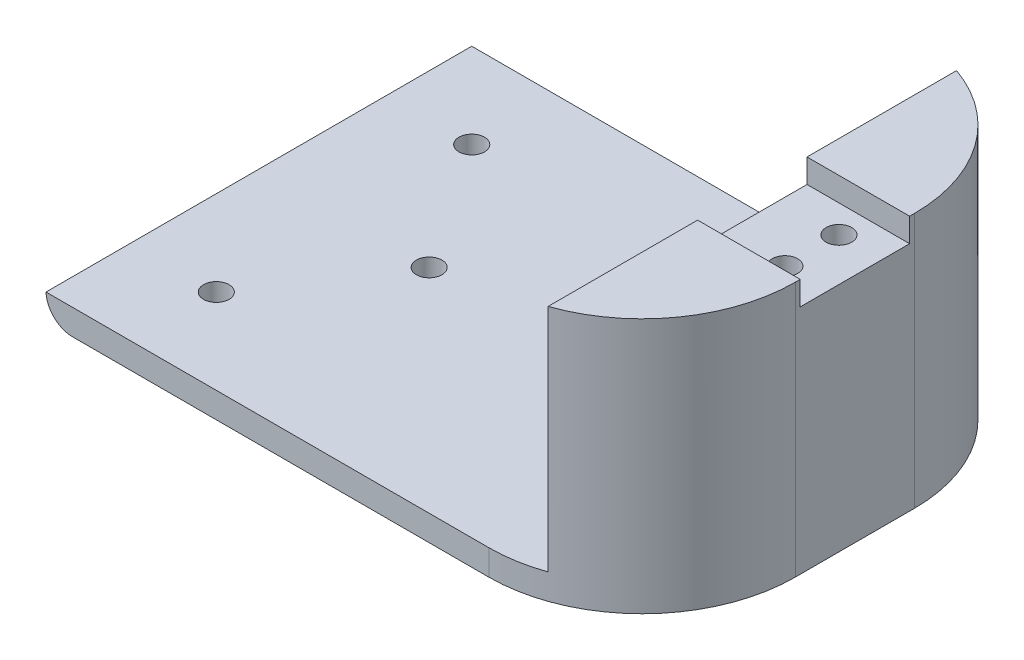
ISO-10303-21;
HEADER;
FILE_DESCRIPTION(('STEP AP214'),'2;1');
FILE_NAME('part.step','',(''),(''),'','','');
FILE_SCHEMA(('AUTOMOTIVE_DESIGN { 1 0 10303 214 1 1 1 1 }'));
ENDSEC;
DATA;
#1=APPLICATION_CONTEXT('core data for automotive mechanical design processes');
#2=APPLICATION_PROTOCOL_DEFINITION('international standard','automotive_design',2000,#1);
#3=PRODUCT_CONTEXT('',#1,'mechanical');
#4=PRODUCT('Part','Part','',(#3));
#5=PRODUCT_RELATED_PRODUCT_CATEGORY('part','',(#4));
#6=PRODUCT_DEFINITION_FORMATION('','',#4);
#7=PRODUCT_DEFINITION_CONTEXT('part definition',#1,'design');
#8=PRODUCT_DEFINITION('design','',#6,#7);
#9=PRODUCT_DEFINITION_SHAPE('','',#8);
#10=(LENGTH_UNIT() NAMED_UNIT(*) SI_UNIT(.MILLI.,.METRE.));
#11=(NAMED_UNIT(*) PLANE_ANGLE_UNIT() SI_UNIT($,.RADIAN.));
#12=(NAMED_UNIT(*) SI_UNIT($,.STERADIAN.) SOLID_ANGLE_UNIT());
#13=UNCERTAINTY_MEASURE_WITH_UNIT(LENGTH_MEASURE(1.E-05),#10,'distance_accuracy_value','');
#14=(GEOMETRIC_REPRESENTATION_CONTEXT(3) GLOBAL_UNCERTAINTY_ASSIGNED_CONTEXT((#13)) GLOBAL_UNIT_ASSIGNED_CONTEXT((#10,
#11,#12)) REPRESENTATION_CONTEXT('',''));
#15=CARTESIAN_POINT('',(0.,0.,0.));
#16=DIRECTION('',(0.,0.,1.));
#17=DIRECTION('',(1.,0.,0.));
#18=AXIS2_PLACEMENT_3D('',#15,#16,#17);
#19=CARTESIAN_POINT('',(57.95,27.,50.));
#20=DIRECTION('',(0.,-1.,0.));
#21=DIRECTION('',(0.,0.,-1.));
#22=AXIS2_PLACEMENT_3D('',#19,#20,#21);
#23=PLANE('',#22);
#24=DIRECTION('',(0.,0.,-1.));
#25=VECTOR('',#24,1.);
#26=CARTESIAN_POINT('',(70.,27.,50.));
#27=LINE('',#26,#25);
#28=CARTESIAN_POINT('',(70.,27.,18.575));
#29=VERTEX_POINT('',#28);
#30=CARTESIAN_POINT('',(70.,27.,18.));
#31=VERTEX_POINT('',#30);
#32=EDGE_CURVE('E204',#29,#31,#27,.T.);
#33=ORIENTED_EDGE('',*,*,#32,.T.);
#34=CARTESIAN_POINT('',(52.,27.,18.));
#35=DIRECTION('',(0.,-1.,0.));
#36=DIRECTION('',(0.,0.,-1.));
#37=AXIS2_PLACEMENT_3D('',#34,#35,#36);
#38=CIRCLE('',#37,18.);
#39=CARTESIAN_POINT('',(57.95,27.,1.01184236004387));
#40=VERTEX_POINT('',#39);
#41=EDGE_CURVE('E226',#31,#40,#38,.F.);
#42=ORIENTED_EDGE('',*,*,#41,.T.);
#43=DIRECTION('',(0.,0.,-1.));
#44=VECTOR('',#43,1.);
#45=CARTESIAN_POINT('',(57.95,27.,50.));
#46=LINE('',#45,#44);
#47=CARTESIAN_POINT('',(57.95,27.,18.575));
#48=VERTEX_POINT('',#47);
#49=EDGE_CURVE('E202',#48,#40,#46,.T.);
#50=ORIENTED_EDGE('',*,*,#49,.F.);
#51=DIRECTION('',(-1.,0.,0.));
#52=VECTOR('',#51,1.);
#53=CARTESIAN_POINT('',(57.95,27.,18.575));
#54=LINE('',#53,#52);
#55=EDGE_CURVE('E154',#29,#48,#54,.T.);
#56=ORIENTED_EDGE('',*,*,#55,.F.);
#57=EDGE_LOOP('',(#33,#42,#50,#56));
#58=FACE_BOUND('',#57,.T.);
#59=ADVANCED_FACE('F41',(#58),#23,.F.);
#60=CARTESIAN_POINT('',(0.,0.,50.));
#61=DIRECTION('',(0.,-1.,0.));
#62=DIRECTION('',(0.,0.,-1.));
#63=AXIS2_PLACEMENT_3D('',#60,#61,#62);
#64=PLANE('',#63);
#65=CARTESIAN_POINT('',(9.99999999999999,0.,10.));
#66=DIRECTION('',(0.,1.,0.));
#67=DIRECTION('',(0.,0.,1.));
#68=AXIS2_PLACEMENT_3D('',#65,#66,#67);
#69=CIRCLE('',#68,1.5);
#70=CARTESIAN_POINT('',(9.99999999999999,0.,11.5));
#71=VERTEX_POINT('',#70);
#72=EDGE_CURVE('E170',#71,#71,#69,.T.);
#73=ORIENTED_EDGE('',*,*,#72,.F.);
#74=EDGE_LOOP('',(#73));
#75=FACE_BOUND('',#74,.T.);
#76=CARTESIAN_POINT('',(20.,0.,25.));
#77=DIRECTION('',(0.,1.,0.));
#78=DIRECTION('',(0.,0.,1.));
#79=AXIS2_PLACEMENT_3D('',#76,#77,#78);
#80=CIRCLE('',#79,1.5);
#81=CARTESIAN_POINT('',(20.,0.,26.5));
#82=VERTEX_POINT('',#81);
#83=EDGE_CURVE('E174',#82,#82,#80,.T.);
#84=ORIENTED_EDGE('',*,*,#83,.F.);
#85=EDGE_LOOP('',(#84));
#86=FACE_BOUND('',#85,.T.);
#87=CARTESIAN_POINT('',(47.95,0.,25.));
#88=DIRECTION('',(0.,1.,0.));
#89=DIRECTION('',(0.,0.,1.));
#90=AXIS2_PLACEMENT_3D('',#87,#88,#89);
#91=CIRCLE('',#90,9.);
#92=CARTESIAN_POINT('',(47.95,0.,34.));
#93=VERTEX_POINT('',#92);
#94=EDGE_CURVE('E187',#93,#93,#91,.T.);
#95=ORIENTED_EDGE('',*,*,#94,.F.);
#96=EDGE_LOOP('',(#95));
#97=FACE_BOUND('',#96,.T.);
#98=CARTESIAN_POINT('',(9.99999999999999,0.,40.));
#99=DIRECTION('',(0.,1.,0.));
#100=DIRECTION('',(0.,0.,1.));
#101=AXIS2_PLACEMENT_3D('',#98,#99,#100);
#102=CIRCLE('',#101,1.5);
#103=CARTESIAN_POINT('',(9.99999999999999,0.,41.5));
#104=VERTEX_POINT('',#103);
#105=EDGE_CURVE('E173',#104,#104,#102,.T.);
#106=ORIENTED_EDGE('',*,*,#105,.F.);
#107=EDGE_LOOP('',(#106));
#108=FACE_BOUND('',#107,.T.);
#109=DIRECTION('',(0.,0.,-1.));
#110=VECTOR('',#109,1.);
#111=CARTESIAN_POINT('',(57.95,0.,50.));
#112=LINE('',#111,#110);
#113=CARTESIAN_POINT('',(57.95,0.,48.9881576399561));
#114=VERTEX_POINT('',#113);
#115=CARTESIAN_POINT('',(57.95,0.,1.01184236004387));
#116=VERTEX_POINT('',#115);
#117=EDGE_CURVE('E197',#114,#116,#112,.T.);
#118=ORIENTED_EDGE('',*,*,#117,.T.);
#119=CARTESIAN_POINT('',(52.,0.,18.));
#120=DIRECTION('',(0.,-1.,0.));
#121=DIRECTION('',(0.,0.,-1.));
#122=AXIS2_PLACEMENT_3D('',#119,#120,#121);
#123=CIRCLE('',#122,18.);
#124=CARTESIAN_POINT('',(52.,0.,0.));
#125=VERTEX_POINT('',#124);
#126=EDGE_CURVE('E234',#116,#125,#123,.F.);
#127=ORIENTED_EDGE('',*,*,#126,.T.);
#128=DIRECTION('',(-1.,0.,0.));
#129=VECTOR('',#128,1.);
#130=CARTESIAN_POINT('',(0.,0.,0.));
#131=LINE('',#130,#129);
#132=CARTESIAN_POINT('',(0.,0.,0.));
#133=VERTEX_POINT('',#132);
#134=EDGE_CURVE('E169',#125,#133,#131,.T.);
#135=ORIENTED_EDGE('',*,*,#134,.T.);
#136=DIRECTION('',(0.,0.,-1.));
#137=VECTOR('',#136,1.);
#138=CARTESIAN_POINT('',(0.,0.,50.));
#139=LINE('',#138,#137);
#140=CARTESIAN_POINT('',(0.,0.,50.));
#141=VERTEX_POINT('',#140);
#142=EDGE_CURVE('E210',#141,#133,#139,.T.);
#143=ORIENTED_EDGE('',*,*,#142,.F.);
#144=DIRECTION('',(-1.,0.,0.));
#145=VECTOR('',#144,1.);
#146=CARTESIAN_POINT('',(0.,0.,50.));
#147=LINE('',#146,#145);
#148=CARTESIAN_POINT('',(52.,0.,50.));
#149=VERTEX_POINT('',#148);
#150=EDGE_CURVE('E192',#149,#141,#147,.T.);
#151=ORIENTED_EDGE('',*,*,#150,.F.);
#152=CARTESIAN_POINT('',(52.,0.,32.));
#153=DIRECTION('',(0.,-1.,0.));
#154=DIRECTION('',(0.,0.,-1.));
#155=AXIS2_PLACEMENT_3D('',#152,#153,#154);
#156=CIRCLE('',#155,18.);
#157=EDGE_CURVE('E232',#149,#114,#156,.F.);
#158=ORIENTED_EDGE('',*,*,#157,.T.);
#159=EDGE_LOOP('',(#118,#127,#135,#143,#151,#158));
#160=FACE_BOUND('',#159,.T.);
#161=ADVANCED_FACE('F247',(#75,#86,#97,#108,#160),#64,.F.);
#162=CARTESIAN_POINT('',(70.,-2.99999999999999,50.));
#163=DIRECTION('',(0.,1.,0.));
#164=DIRECTION('',(-1.,0.,0.));
#165=AXIS2_PLACEMENT_3D('',#162,#163,#164);
#166=PLANE('',#165);
#167=CARTESIAN_POINT('',(9.99999999999999,-3.,10.));
#168=DIRECTION('',(0.,1.,0.));
#169=DIRECTION('',(0.,0.,1.));
#170=AXIS2_PLACEMENT_3D('',#167,#168,#169);
#171=CIRCLE('',#170,1.5);
#172=CARTESIAN_POINT('',(9.99999999999999,-3.,11.5));
#173=VERTEX_POINT('',#172);
#174=EDGE_CURVE('E166',#173,#173,#171,.T.);
#175=ORIENTED_EDGE('',*,*,#174,.T.);
#176=EDGE_LOOP('',(#175));
#177=FACE_BOUND('',#176,.T.);
#178=CARTESIAN_POINT('',(20.,-3.,25.));
#179=DIRECTION('',(0.,1.,0.));
#180=DIRECTION('',(0.,0.,1.));
#181=AXIS2_PLACEMENT_3D('',#178,#179,#180);
#182=CIRCLE('',#181,1.5);
#183=CARTESIAN_POINT('',(20.,-3.,26.5));
#184=VERTEX_POINT('',#183);
#185=EDGE_CURVE('E178',#184,#184,#182,.T.);
#186=ORIENTED_EDGE('',*,*,#185,.T.);
#187=EDGE_LOOP('',(#186));
#188=FACE_BOUND('',#187,.T.);
#189=CARTESIAN_POINT('',(47.95,-3.,25.));
#190=DIRECTION('',(0.,1.,0.));
#191=DIRECTION('',(0.,0.,1.));
#192=AXIS2_PLACEMENT_3D('',#189,#190,#191);
#193=CIRCLE('',#192,9.);
#194=CARTESIAN_POINT('',(47.95,-3.,34.));
#195=VERTEX_POINT('',#194);
#196=EDGE_CURVE('E177',#195,#195,#193,.T.);
#197=ORIENTED_EDGE('',*,*,#196,.T.);
#198=EDGE_LOOP('',(#197));
#199=FACE_BOUND('',#198,.T.);
#200=CARTESIAN_POINT('',(9.99999999999999,-3.,40.));
#201=DIRECTION('',(0.,1.,0.));
#202=DIRECTION('',(0.,0.,1.));
#203=AXIS2_PLACEMENT_3D('',#200,#201,#202);
#204=CIRCLE('',#203,1.5);
#205=CARTESIAN_POINT('',(9.99999999999999,-3.,41.5));
#206=VERTEX_POINT('',#205);
#207=EDGE_CURVE('E184',#206,#206,#204,.T.);
#208=ORIENTED_EDGE('',*,*,#207,.T.);
#209=EDGE_LOOP('',(#208));
#210=FACE_BOUND('',#209,.T.);
#211=DIRECTION('',(1.,0.,0.));
#212=VECTOR('',#211,1.);
#213=CARTESIAN_POINT('',(70.,-2.99999999999999,0.));
#214=LINE('',#213,#212);
#215=CARTESIAN_POINT('',(3.1224989991992,-3.,0.));
#216=VERTEX_POINT('',#215);
#217=CARTESIAN_POINT('',(52.,-2.99999999999999,0.));
#218=VERTEX_POINT('',#217);
#219=EDGE_CURVE('E195',#216,#218,#214,.T.);
#220=ORIENTED_EDGE('',*,*,#219,.T.);
#221=CARTESIAN_POINT('',(52.,-3.,18.));
#222=DIRECTION('',(0.,1.,0.));
#223=DIRECTION('',(-1.,0.,0.));
#224=AXIS2_PLACEMENT_3D('',#221,#222,#223);
#225=CIRCLE('',#224,18.);
#226=CARTESIAN_POINT('',(70.,-2.99999999999999,18.));
#227=VERTEX_POINT('',#226);
#228=EDGE_CURVE('E238',#218,#227,#225,.F.);
#229=ORIENTED_EDGE('',*,*,#228,.T.);
#230=DIRECTION('',(0.,0.,-1.));
#231=VECTOR('',#230,1.);
#232=CARTESIAN_POINT('',(70.,-2.99999999999999,50.));
#233=LINE('',#232,#231);
#234=CARTESIAN_POINT('',(70.,-2.99999999999999,32.));
#235=VERTEX_POINT('',#234);
#236=EDGE_CURVE('E207',#235,#227,#233,.T.);
#237=ORIENTED_EDGE('',*,*,#236,.F.);
#238=CARTESIAN_POINT('',(52.,-2.99999999999999,32.));
#239=DIRECTION('',(0.,1.,0.));
#240=DIRECTION('',(-1.,0.,0.));
#241=AXIS2_PLACEMENT_3D('',#238,#239,#240);
#242=CIRCLE('',#241,18.);
#243=CARTESIAN_POINT('',(52.,-2.99999999999999,50.));
#244=VERTEX_POINT('',#243);
#245=EDGE_CURVE('E56',#235,#244,#242,.F.);
#246=ORIENTED_EDGE('',*,*,#245,.T.);
#247=DIRECTION('',(1.,0.,0.));
#248=VECTOR('',#247,1.);
#249=CARTESIAN_POINT('',(70.,-2.99999999999999,50.));
#250=LINE('',#249,#248);
#251=CARTESIAN_POINT('',(3.1224989991992,-3.,50.));
#252=VERTEX_POINT('',#251);
#253=EDGE_CURVE('E194',#252,#244,#250,.T.);
#254=ORIENTED_EDGE('',*,*,#253,.F.);
#255=DIRECTION('',(0.,0.,-1.));
#256=VECTOR('',#255,1.);
#257=CARTESIAN_POINT('',(3.1224989991992,-3.,50.));
#258=LINE('',#257,#256);
#259=EDGE_CURVE('E213',#252,#216,#258,.T.);
#260=ORIENTED_EDGE('',*,*,#259,.T.);
#261=EDGE_LOOP('',(#220,#229,#237,#246,#254,#260));
#262=FACE_BOUND('',#261,.T.);
#263=ADVANCED_FACE('F253',(#177,#188,#199,#210,#262),#166,.F.);
#264=CARTESIAN_POINT('',(70.,27.,50.));
#265=DIRECTION('',(-1.,0.,0.));
#266=DIRECTION('',(0.,0.,1.));
#267=AXIS2_PLACEMENT_3D('',#264,#265,#266);
#268=PLANE('',#267);
#269=ORIENTED_EDGE('',*,*,#236,.T.);
#270=DIRECTION('',(0.,1.,0.));
#271=VECTOR('',#270,1.);
#272=CARTESIAN_POINT('',(70.,27.,18.));
#273=LINE('',#272,#271);
#274=EDGE_CURVE('E223',#227,#31,#273,.T.);
#275=ORIENTED_EDGE('',*,*,#274,.T.);
#276=ORIENTED_EDGE('',*,*,#32,.F.);
#277=DIRECTION('',(0.,1.,0.));
#278=VECTOR('',#277,1.);
#279=CARTESIAN_POINT('',(70.,24.2,18.575));
#280=LINE('',#279,#278);
#281=CARTESIAN_POINT('',(70.,24.2,18.575));
#282=VERTEX_POINT('',#281);
#283=EDGE_CURVE('E161',#282,#29,#280,.T.);
#284=ORIENTED_EDGE('',*,*,#283,.F.);
#285=DIRECTION('',(0.,0.,-1.));
#286=VECTOR('',#285,1.);
#287=CARTESIAN_POINT('',(70.,24.2,18.575));
#288=LINE('',#287,#286);
#289=CARTESIAN_POINT('',(70.,24.2,31.425));
#290=VERTEX_POINT('',#289);
#291=EDGE_CURVE('E144',#290,#282,#288,.T.);
#292=ORIENTED_EDGE('',*,*,#291,.F.);
#293=DIRECTION('',(0.,1.,0.));
#294=VECTOR('',#293,1.);
#295=CARTESIAN_POINT('',(70.,24.2,31.425));
#296=LINE('',#295,#294);
#297=CARTESIAN_POINT('',(70.,27.,31.425));
#298=VERTEX_POINT('',#297);
#299=EDGE_CURVE('E141',#290,#298,#296,.T.);
#300=ORIENTED_EDGE('',*,*,#299,.T.);
#301=CARTESIAN_POINT('',(70.,27.,32.));
#302=VERTEX_POINT('',#301);
#303=EDGE_CURVE('E205',#302,#298,#27,.T.);
#304=ORIENTED_EDGE('',*,*,#303,.F.);
#305=DIRECTION('',(0.,1.,0.));
#306=VECTOR('',#305,1.);
#307=CARTESIAN_POINT('',(70.,-2.99999999999999,32.));
#308=LINE('',#307,#306);
#309=EDGE_CURVE('E221',#302,#235,#308,.F.);
#310=ORIENTED_EDGE('',*,*,#309,.T.);
#311=EDGE_LOOP('',(#269,#275,#276,#284,#292,#300,#304,#310));
#312=FACE_BOUND('',#311,.T.);
#313=ADVANCED_FACE('F262',(#312),#268,.F.);
#314=CARTESIAN_POINT('',(57.95,27.,48.9881576399561));
#315=VERTEX_POINT('',#314);
#316=CARTESIAN_POINT('',(57.95,27.,31.425));
#317=VERTEX_POINT('',#316);
#318=EDGE_CURVE('E159',#315,#317,#46,.T.);
#319=ORIENTED_EDGE('',*,*,#318,.F.);
#320=CARTESIAN_POINT('',(52.,27.,32.));
#321=DIRECTION('',(0.,-1.,0.));
#322=DIRECTION('',(0.,0.,-1.));
#323=AXIS2_PLACEMENT_3D('',#320,#321,#322);
#324=CIRCLE('',#323,18.);
#325=EDGE_CURVE('E11',#315,#302,#324,.F.);
#326=ORIENTED_EDGE('',*,*,#325,.T.);
#327=ORIENTED_EDGE('',*,*,#303,.T.);
#328=DIRECTION('',(1.,0.,0.));
#329=VECTOR('',#328,1.);
#330=CARTESIAN_POINT('',(57.95,27.,31.425));
#331=LINE('',#330,#329);
#332=EDGE_CURVE('E271',#317,#298,#331,.T.);
#333=ORIENTED_EDGE('',*,*,#332,.F.);
#334=EDGE_LOOP('',(#319,#326,#327,#333));
#335=FACE_BOUND('',#334,.T.);
#336=ADVANCED_FACE('F270',(#335),#23,.F.);
#337=CARTESIAN_POINT('',(57.95,0.,50.));
#338=DIRECTION('',(1.,0.,0.));
#339=DIRECTION('',(0.,0.,-1.));
#340=AXIS2_PLACEMENT_3D('',#337,#338,#339);
#341=PLANE('',#340);
#342=ORIENTED_EDGE('',*,*,#49,.T.);
#343=DIRECTION('',(0.,1.,0.));
#344=VECTOR('',#343,1.);
#345=CARTESIAN_POINT('',(57.95,27.,1.01184236004387));
#346=LINE('',#345,#344);
#347=EDGE_CURVE('E230',#40,#116,#346,.F.);
#348=ORIENTED_EDGE('',*,*,#347,.T.);
#349=ORIENTED_EDGE('',*,*,#117,.F.);
#350=DIRECTION('',(0.,-1.,0.));
#351=VECTOR('',#350,1.);
#352=CARTESIAN_POINT('',(57.95,0.,48.9881576399561));
#353=LINE('',#352,#351);
#354=EDGE_CURVE('E228',#114,#315,#353,.F.);
#355=ORIENTED_EDGE('',*,*,#354,.T.);
#356=ORIENTED_EDGE('',*,*,#318,.T.);
#357=DIRECTION('',(0.,1.,0.));
#358=VECTOR('',#357,1.);
#359=CARTESIAN_POINT('',(57.95,24.2,31.425));
#360=LINE('',#359,#358);
#361=CARTESIAN_POINT('',(57.95,24.2,31.425));
#362=VERTEX_POINT('',#361);
#363=EDGE_CURVE('E138',#362,#317,#360,.T.);
#364=ORIENTED_EDGE('',*,*,#363,.F.);
#365=DIRECTION('',(0.,0.,1.));
#366=VECTOR('',#365,1.);
#367=CARTESIAN_POINT('',(57.95,24.2,18.575));
#368=LINE('',#367,#366);
#369=CARTESIAN_POINT('',(57.95,24.2,18.575));
#370=VERTEX_POINT('',#369);
#371=EDGE_CURVE('E145',#370,#362,#368,.T.);
#372=ORIENTED_EDGE('',*,*,#371,.F.);
#373=DIRECTION('',(0.,1.,0.));
#374=VECTOR('',#373,1.);
#375=CARTESIAN_POINT('',(57.95,24.2,18.575));
#376=LINE('',#375,#374);
#377=EDGE_CURVE('E181',#370,#48,#376,.T.);
#378=ORIENTED_EDGE('',*,*,#377,.T.);
#379=EDGE_LOOP('',(#342,#348,#349,#355,#356,#364,#372,#378));
#380=FACE_BOUND('',#379,.T.);
#381=ADVANCED_FACE('F157',(#380),#341,.F.);
#382=CARTESIAN_POINT('',(0.,0.,50.));
#383=DIRECTION('',(0.,0.,1.));
#384=DIRECTION('',(1.,0.,0.));
#385=AXIS2_PLACEMENT_3D('',#382,#383,#384);
#386=PLANE('',#385);
#387=ORIENTED_EDGE('',*,*,#253,.T.);
#388=DIRECTION('',(0.,1.,0.));
#389=VECTOR('',#388,1.);
#390=CARTESIAN_POINT('',(52.,27.,50.));
#391=LINE('',#390,#389);
#392=EDGE_CURVE('E49',#244,#149,#391,.T.);
#393=ORIENTED_EDGE('',*,*,#392,.T.);
#394=ORIENTED_EDGE('',*,*,#150,.T.);
#395=CARTESIAN_POINT('',(3.1224989991992,0.125,50.));
#396=DIRECTION('',(0.,0.,1.));
#397=DIRECTION('',(1.,0.,0.));
#398=AXIS2_PLACEMENT_3D('',#395,#396,#397);
#399=CIRCLE('',#398,3.125);
#400=EDGE_CURVE('E219',#141,#252,#399,.T.);
#401=ORIENTED_EDGE('',*,*,#400,.T.);
#402=EDGE_LOOP('',(#387,#393,#394,#401));
#403=FACE_BOUND('',#402,.T.);
#404=ADVANCED_FACE('F243',(#403),#386,.T.);
#405=CARTESIAN_POINT('',(0.,0.,0.));
#406=DIRECTION('',(0.,0.,1.));
#407=DIRECTION('',(1.,0.,0.));
#408=AXIS2_PLACEMENT_3D('',#405,#406,#407);
#409=PLANE('',#408);
#410=ORIENTED_EDGE('',*,*,#134,.F.);
#411=DIRECTION('',(0.,1.,0.));
#412=VECTOR('',#411,1.);
#413=CARTESIAN_POINT('',(52.,0.,0.));
#414=LINE('',#413,#412);
#415=EDGE_CURVE('E64',#125,#218,#414,.F.);
#416=ORIENTED_EDGE('',*,*,#415,.T.);
#417=ORIENTED_EDGE('',*,*,#219,.F.);
#418=CARTESIAN_POINT('',(3.1224989991992,0.125,0.));
#419=DIRECTION('',(0.,0.,1.));
#420=DIRECTION('',(1.,0.,0.));
#421=AXIS2_PLACEMENT_3D('',#418,#419,#420);
#422=CIRCLE('',#421,3.125);
#423=EDGE_CURVE('E216',#216,#133,#422,.F.);
#424=ORIENTED_EDGE('',*,*,#423,.T.);
#425=EDGE_LOOP('',(#410,#416,#417,#424));
#426=FACE_BOUND('',#425,.T.);
#427=ADVANCED_FACE('F255',(#426),#409,.F.);
#428=CARTESIAN_POINT('',(9.99999999999999,-3.,40.));
#429=DIRECTION('',(0.,1.,0.));
#430=DIRECTION('',(0.,0.,1.));
#431=AXIS2_PLACEMENT_3D('',#428,#429,#430);
#432=CYLINDRICAL_SURFACE('',#431,1.5);
#433=ORIENTED_EDGE('',*,*,#207,.F.);
#434=EDGE_LOOP('',(#433));
#435=FACE_BOUND('',#434,.T.);
#436=ORIENTED_EDGE('',*,*,#105,.T.);
#437=EDGE_LOOP('',(#436));
#438=FACE_BOUND('',#437,.T.);
#439=ADVANCED_FACE('F424',(#435,#438),#432,.F.);
#440=CARTESIAN_POINT('',(47.95,-3.,25.));
#441=DIRECTION('',(0.,1.,0.));
#442=DIRECTION('',(0.,0.,1.));
#443=AXIS2_PLACEMENT_3D('',#440,#441,#442);
#444=CYLINDRICAL_SURFACE('',#443,9.);
#445=ORIENTED_EDGE('',*,*,#196,.F.);
#446=EDGE_LOOP('',(#445));
#447=FACE_BOUND('',#446,.T.);
#448=ORIENTED_EDGE('',*,*,#94,.T.);
#449=EDGE_LOOP('',(#448));
#450=FACE_BOUND('',#449,.T.);
#451=ADVANCED_FACE('F414',(#447,#450),#444,.F.);
#452=CARTESIAN_POINT('',(20.,-3.,25.));
#453=DIRECTION('',(0.,1.,0.));
#454=DIRECTION('',(0.,0.,1.));
#455=AXIS2_PLACEMENT_3D('',#452,#453,#454);
#456=CYLINDRICAL_SURFACE('',#455,1.5);
#457=ORIENTED_EDGE('',*,*,#185,.F.);
#458=EDGE_LOOP('',(#457));
#459=FACE_BOUND('',#458,.T.);
#460=ORIENTED_EDGE('',*,*,#83,.T.);
#461=EDGE_LOOP('',(#460));
#462=FACE_BOUND('',#461,.T.);
#463=ADVANCED_FACE('F404',(#459,#462),#456,.F.);
#464=CARTESIAN_POINT('',(9.99999999999999,-3.,10.));
#465=DIRECTION('',(0.,1.,0.));
#466=DIRECTION('',(0.,0.,1.));
#467=AXIS2_PLACEMENT_3D('',#464,#465,#466);
#468=CYLINDRICAL_SURFACE('',#467,1.5);
#469=ORIENTED_EDGE('',*,*,#174,.F.);
#470=EDGE_LOOP('',(#469));
#471=FACE_BOUND('',#470,.T.);
#472=ORIENTED_EDGE('',*,*,#72,.T.);
#473=EDGE_LOOP('',(#472));
#474=FACE_BOUND('',#473,.T.);
#475=ADVANCED_FACE('F391',(#471,#474),#468,.F.);
#476=CARTESIAN_POINT('',(57.95,24.2,18.575));
#477=DIRECTION('',(0.,0.,-1.));
#478=DIRECTION('',(-1.,0.,0.));
#479=AXIS2_PLACEMENT_3D('',#476,#477,#478);
#480=PLANE('',#479);
#481=ORIENTED_EDGE('',*,*,#55,.T.);
#482=ORIENTED_EDGE('',*,*,#377,.F.);
#483=DIRECTION('',(-1.,0.,0.));
#484=VECTOR('',#483,1.);
#485=CARTESIAN_POINT('',(57.95,24.2,18.575));
#486=LINE('',#485,#484);
#487=EDGE_CURVE('E150',#282,#370,#486,.T.);
#488=ORIENTED_EDGE('',*,*,#487,.F.);
#489=ORIENTED_EDGE('',*,*,#283,.T.);
#490=EDGE_LOOP('',(#481,#482,#488,#489));
#491=FACE_BOUND('',#490,.T.);
#492=ADVANCED_FACE('F283',(#491),#480,.F.);
#493=CARTESIAN_POINT('',(57.95,24.2,31.425));
#494=DIRECTION('',(0.,0.,1.));
#495=DIRECTION('',(1.,0.,0.));
#496=AXIS2_PLACEMENT_3D('',#493,#494,#495);
#497=PLANE('',#496);
#498=ORIENTED_EDGE('',*,*,#332,.T.);
#499=ORIENTED_EDGE('',*,*,#299,.F.);
#500=DIRECTION('',(1.,0.,0.));
#501=VECTOR('',#500,1.);
#502=CARTESIAN_POINT('',(57.95,24.2,31.425));
#503=LINE('',#502,#501);
#504=EDGE_CURVE('E133',#362,#290,#503,.T.);
#505=ORIENTED_EDGE('',*,*,#504,.F.);
#506=ORIENTED_EDGE('',*,*,#363,.T.);
#507=EDGE_LOOP('',(#498,#499,#505,#506));
#508=FACE_BOUND('',#507,.T.);
#509=ADVANCED_FACE('F136',(#508),#497,.F.);
#510=CARTESIAN_POINT('',(0.,24.2,0.));
#511=DIRECTION('',(0.,1.,0.));
#512=DIRECTION('',(-1.,0.,0.));
#513=AXIS2_PLACEMENT_3D('',#510,#511,#512);
#514=PLANE('',#513);
#515=CARTESIAN_POINT('',(64.95,24.2,28.175));
#516=DIRECTION('',(0.,1.,0.));
#517=DIRECTION('',(-1.,0.,0.));
#518=AXIS2_PLACEMENT_3D('',#515,#516,#517);
#519=CIRCLE('',#518,1.5);
#520=CARTESIAN_POINT('',(63.45,24.2,28.175));
#521=VERTEX_POINT('',#520);
#522=EDGE_CURVE('E276',#521,#521,#519,.T.);
#523=ORIENTED_EDGE('',*,*,#522,.F.);
#524=EDGE_LOOP('',(#523));
#525=FACE_BOUND('',#524,.T.);
#526=CARTESIAN_POINT('',(64.95,24.2,21.825));
#527=DIRECTION('',(0.,1.,0.));
#528=DIRECTION('',(-1.,0.,0.));
#529=AXIS2_PLACEMENT_3D('',#526,#527,#528);
#530=CIRCLE('',#529,1.5);
#531=CARTESIAN_POINT('',(63.45,24.2,21.825));
#532=VERTEX_POINT('',#531);
#533=EDGE_CURVE('E504',#532,#532,#530,.T.);
#534=ORIENTED_EDGE('',*,*,#533,.F.);
#535=EDGE_LOOP('',(#534));
#536=FACE_BOUND('',#535,.T.);
#537=ORIENTED_EDGE('',*,*,#371,.T.);
#538=ORIENTED_EDGE('',*,*,#504,.T.);
#539=ORIENTED_EDGE('',*,*,#291,.T.);
#540=ORIENTED_EDGE('',*,*,#487,.T.);
#541=EDGE_LOOP('',(#537,#538,#539,#540));
#542=FACE_BOUND('',#541,.T.);
#543=ADVANCED_FACE('F148',(#525,#536,#542),#514,.T.);
#544=CARTESIAN_POINT('',(64.95,21.2,21.825));
#545=DIRECTION('',(0.,1.,0.));
#546=DIRECTION('',(-1.,0.,0.));
#547=AXIS2_PLACEMENT_3D('',#544,#545,#546);
#548=CYLINDRICAL_SURFACE('',#547,1.5);
#549=CARTESIAN_POINT('',(64.95,21.2,21.825));
#550=DIRECTION('',(0.,1.,0.));
#551=DIRECTION('',(-1.,0.,0.));
#552=AXIS2_PLACEMENT_3D('',#549,#550,#551);
#553=CIRCLE('',#552,1.5);
#554=CARTESIAN_POINT('',(63.45,21.2,21.825));
#555=VERTEX_POINT('',#554);
#556=EDGE_CURVE('E506',#555,#555,#553,.T.);
#557=ORIENTED_EDGE('',*,*,#556,.F.);
#558=EDGE_LOOP('',(#557));
#559=FACE_BOUND('',#558,.T.);
#560=ORIENTED_EDGE('',*,*,#533,.T.);
#561=EDGE_LOOP('',(#560));
#562=FACE_BOUND('',#561,.T.);
#563=ADVANCED_FACE('F355',(#559,#562),#548,.F.);
#564=CARTESIAN_POINT('',(64.95,21.2,21.825));
#565=DIRECTION('',(0.,1.,0.));
#566=DIRECTION('',(-1.,0.,0.));
#567=AXIS2_PLACEMENT_3D('',#564,#565,#566);
#568=PLANE('',#567);
#569=ORIENTED_EDGE('',*,*,#556,.T.);
#570=EDGE_LOOP('',(#569));
#571=FACE_BOUND('',#570,.T.);
#572=ADVANCED_FACE('F345',(#571),#568,.T.);
#573=CARTESIAN_POINT('',(64.95,21.2,28.175));
#574=DIRECTION('',(0.,1.,0.));
#575=DIRECTION('',(-1.,0.,0.));
#576=AXIS2_PLACEMENT_3D('',#573,#574,#575);
#577=CYLINDRICAL_SURFACE('',#576,1.5);
#578=CARTESIAN_POINT('',(64.95,21.2,28.175));
#579=DIRECTION('',(0.,1.,0.));
#580=DIRECTION('',(-1.,0.,0.));
#581=AXIS2_PLACEMENT_3D('',#578,#579,#580);
#582=CIRCLE('',#581,1.5);
#583=CARTESIAN_POINT('',(63.45,21.2,28.175));
#584=VERTEX_POINT('',#583);
#585=EDGE_CURVE('E272',#584,#584,#582,.T.);
#586=ORIENTED_EDGE('',*,*,#585,.F.);
#587=EDGE_LOOP('',(#586));
#588=FACE_BOUND('',#587,.T.);
#589=ORIENTED_EDGE('',*,*,#522,.T.);
#590=EDGE_LOOP('',(#589));
#591=FACE_BOUND('',#590,.T.);
#592=ADVANCED_FACE('F335',(#588,#591),#577,.F.);
#593=CARTESIAN_POINT('',(64.95,21.2,28.175));
#594=DIRECTION('',(0.,1.,0.));
#595=DIRECTION('',(-1.,0.,0.));
#596=AXIS2_PLACEMENT_3D('',#593,#594,#595);
#597=PLANE('',#596);
#598=ORIENTED_EDGE('',*,*,#585,.T.);
#599=EDGE_LOOP('',(#598));
#600=FACE_BOUND('',#599,.T.);
#601=ADVANCED_FACE('F307',(#600),#597,.T.);
#602=CARTESIAN_POINT('',(3.1224989991992,0.125,50.));
#603=DIRECTION('',(0.,0.,-1.));
#604=DIRECTION('',(-1.,0.,0.));
#605=AXIS2_PLACEMENT_3D('',#602,#603,#604);
#606=CYLINDRICAL_SURFACE('',#605,3.125);
#607=ORIENTED_EDGE('',*,*,#400,.F.);
#608=ORIENTED_EDGE('',*,*,#142,.T.);
#609=ORIENTED_EDGE('',*,*,#423,.F.);
#610=ORIENTED_EDGE('',*,*,#259,.F.);
#611=EDGE_LOOP('',(#607,#608,#609,#610));
#612=FACE_BOUND('',#611,.T.);
#613=ADVANCED_FACE('F252',(#612),#606,.T.);
#614=CARTESIAN_POINT('',(52.,27.,18.));
#615=DIRECTION('',(0.,1.,0.));
#616=DIRECTION('',(0.,0.,1.));
#617=AXIS2_PLACEMENT_3D('',#614,#615,#616);
#618=CYLINDRICAL_SURFACE('',#617,18.);
#619=ORIENTED_EDGE('',*,*,#228,.F.);
#620=ORIENTED_EDGE('',*,*,#415,.F.);
#621=ORIENTED_EDGE('',*,*,#126,.F.);
#622=ORIENTED_EDGE('',*,*,#347,.F.);
#623=ORIENTED_EDGE('',*,*,#41,.F.);
#624=ORIENTED_EDGE('',*,*,#274,.F.);
#625=EDGE_LOOP('',(#619,#620,#621,#622,#623,#624));
#626=FACE_BOUND('',#625,.T.);
#627=ADVANCED_FACE('F258',(#626),#618,.T.);
#628=CARTESIAN_POINT('',(52.,0.,32.));
#629=DIRECTION('',(0.,-1.,0.));
#630=DIRECTION('',(0.,0.,-1.));
#631=AXIS2_PLACEMENT_3D('',#628,#629,#630);
#632=CYLINDRICAL_SURFACE('',#631,18.);
#633=ORIENTED_EDGE('',*,*,#245,.F.);
#634=ORIENTED_EDGE('',*,*,#309,.F.);
#635=ORIENTED_EDGE('',*,*,#325,.F.);
#636=ORIENTED_EDGE('',*,*,#354,.F.);
#637=ORIENTED_EDGE('',*,*,#157,.F.);
#638=ORIENTED_EDGE('',*,*,#392,.F.);
#639=EDGE_LOOP('',(#633,#634,#635,#636,#637,#638));
#640=FACE_BOUND('',#639,.T.);
#641=ADVANCED_FACE('F43',(#640),#632,.T.);
#642=CLOSED_SHELL('',(#59,#161,#263,#313,#336,#381,#404,#427,#439,#451,#463,#475,#492,#509,#543,
#563,#572,#592,#601,#613,#627,#641));
#643=MANIFOLD_SOLID_BREP('B2',#642);
#644=ADVANCED_BREP_SHAPE_REPRESENTATION('',(#18,#643),#14);
#645=SHAPE_DEFINITION_REPRESENTATION(#9,#644);
ENDSEC;
END-ISO-10303-21;
